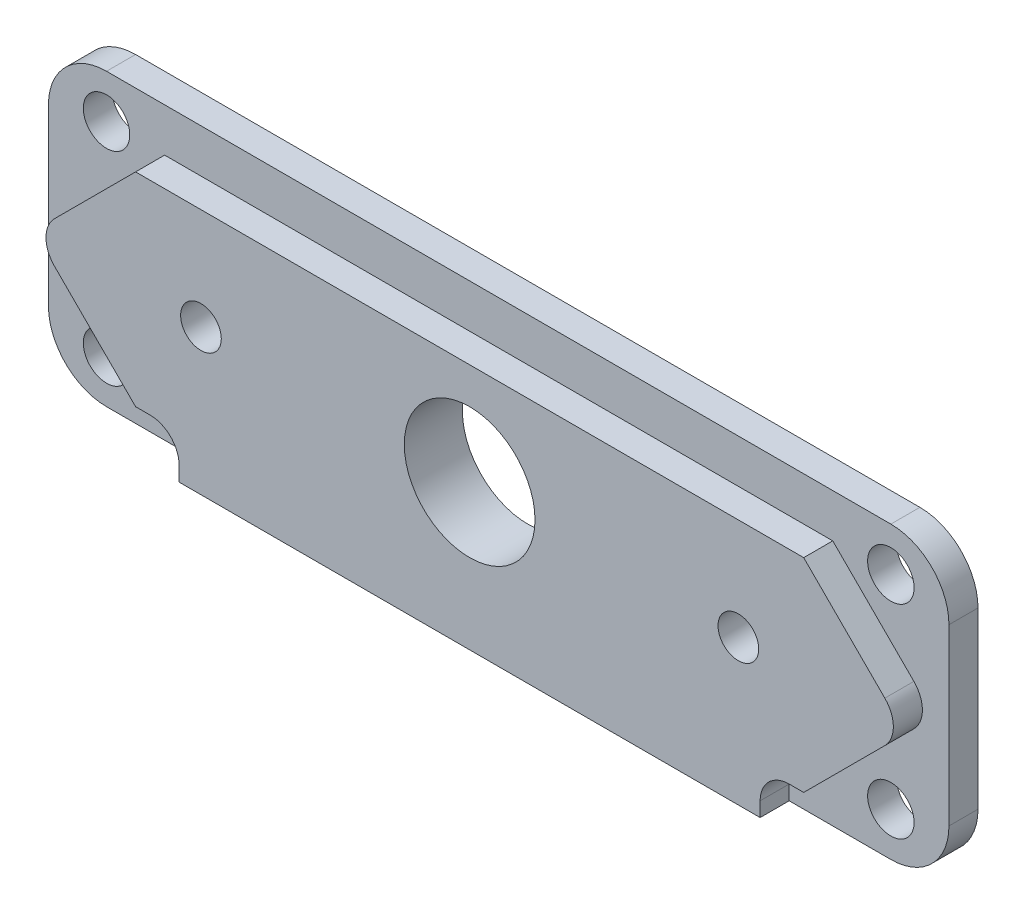
ISO-10303-21;
HEADER;
FILE_DESCRIPTION(('STEP AP214'),'2;1');
FILE_NAME('part.step','',(''),(''),'','','');
FILE_SCHEMA(('AUTOMOTIVE_DESIGN { 1 0 10303 214 1 1 1 1 }'));
ENDSEC;
DATA;
#1=APPLICATION_CONTEXT('core data for automotive mechanical design processes');
#2=APPLICATION_PROTOCOL_DEFINITION('international standard','automotive_design',2000,#1);
#3=PRODUCT_CONTEXT('',#1,'mechanical');
#4=PRODUCT('Part','Part','',(#3));
#5=PRODUCT_RELATED_PRODUCT_CATEGORY('part','',(#4));
#6=PRODUCT_DEFINITION_FORMATION('','',#4);
#7=PRODUCT_DEFINITION_CONTEXT('part definition',#1,'design');
#8=PRODUCT_DEFINITION('design','',#6,#7);
#9=PRODUCT_DEFINITION_SHAPE('','',#8);
#10=(LENGTH_UNIT() NAMED_UNIT(*) SI_UNIT(.MILLI.,.METRE.));
#11=(NAMED_UNIT(*) PLANE_ANGLE_UNIT() SI_UNIT($,.RADIAN.));
#12=(NAMED_UNIT(*) SI_UNIT($,.STERADIAN.) SOLID_ANGLE_UNIT());
#13=UNCERTAINTY_MEASURE_WITH_UNIT(LENGTH_MEASURE(1.E-05),#10,'distance_accuracy_value','');
#14=(GEOMETRIC_REPRESENTATION_CONTEXT(3) GLOBAL_UNCERTAINTY_ASSIGNED_CONTEXT((#13)) GLOBAL_UNIT_ASSIGNED_CONTEXT((#10,
#11,#12)) REPRESENTATION_CONTEXT('',''));
#15=CARTESIAN_POINT('',(0.,0.,0.));
#16=DIRECTION('',(0.,0.,1.));
#17=DIRECTION('',(1.,0.,0.));
#18=AXIS2_PLACEMENT_3D('',#15,#16,#17);
#19=CARTESIAN_POINT('',(27.,6.,2.));
#20=DIRECTION('',(0.,0.,-1.));
#21=DIRECTION('',(-1.,0.,0.));
#22=AXIS2_PLACEMENT_3D('',#19,#20,#21);
#23=PLANE('',#22);
#24=CARTESIAN_POINT('',(27.,-7.,2.));
#25=DIRECTION('',(0.,0.,-1.));
#26=DIRECTION('',(-1.,0.,0.));
#27=AXIS2_PLACEMENT_3D('',#24,#25,#26);
#28=CIRCLE('',#27,1.6);
#29=CARTESIAN_POINT('',(25.4,-7.,2.));
#30=VERTEX_POINT('',#29);
#31=EDGE_CURVE('E715',#30,#30,#28,.F.);
#32=ORIENTED_EDGE('',*,*,#31,.F.);
#33=EDGE_LOOP('',(#32));
#34=FACE_BOUND('',#33,.T.);
#35=CARTESIAN_POINT('',(-27.,-7.,2.));
#36=DIRECTION('',(0.,0.,-1.));
#37=DIRECTION('',(-1.,0.,0.));
#38=AXIS2_PLACEMENT_3D('',#35,#36,#37);
#39=CIRCLE('',#38,1.6);
#40=CARTESIAN_POINT('',(-28.6,-7.,2.));
#41=VERTEX_POINT('',#40);
#42=EDGE_CURVE('E719',#41,#41,#39,.F.);
#43=ORIENTED_EDGE('',*,*,#42,.F.);
#44=EDGE_LOOP('',(#43));
#45=FACE_BOUND('',#44,.T.);
#46=CARTESIAN_POINT('',(-27.,7.,2.));
#47=DIRECTION('',(0.,0.,-1.));
#48=DIRECTION('',(-1.,0.,0.));
#49=AXIS2_PLACEMENT_3D('',#46,#47,#48);
#50=CIRCLE('',#49,1.6);
#51=CARTESIAN_POINT('',(-28.6,7.,2.));
#52=VERTEX_POINT('',#51);
#53=EDGE_CURVE('E728',#52,#52,#50,.F.);
#54=ORIENTED_EDGE('',*,*,#53,.F.);
#55=EDGE_LOOP('',(#54));
#56=FACE_BOUND('',#55,.T.);
#57=CARTESIAN_POINT('',(27.,7.,2.));
#58=DIRECTION('',(0.,0.,-1.));
#59=DIRECTION('',(-1.,0.,0.));
#60=AXIS2_PLACEMENT_3D('',#57,#58,#59);
#61=CIRCLE('',#60,1.6);
#62=CARTESIAN_POINT('',(25.4,7.,2.));
#63=VERTEX_POINT('',#62);
#64=EDGE_CURVE('E734',#63,#63,#61,.F.);
#65=ORIENTED_EDGE('',*,*,#64,.F.);
#66=EDGE_LOOP('',(#65));
#67=FACE_BOUND('',#66,.T.);
#68=DIRECTION('',(0.,1.,0.));
#69=VECTOR('',#68,1.);
#70=CARTESIAN_POINT('',(20.,-10.,2.));
#71=LINE('',#70,#69);
#72=CARTESIAN_POINT('',(20.,-10.,2.));
#73=VERTEX_POINT('',#72);
#74=CARTESIAN_POINT('',(20.,-9.00000000000002,2.));
#75=VERTEX_POINT('',#74);
#76=EDGE_CURVE('E330',#73,#75,#71,.T.);
#77=ORIENTED_EDGE('',*,*,#76,.F.);
#78=DIRECTION('',(1.,0.,0.));
#79=VECTOR('',#78,1.);
#80=CARTESIAN_POINT('',(-27.,-10.,2.));
#81=LINE('',#80,#79);
#82=CARTESIAN_POINT('',(27.,-10.,2.));
#83=VERTEX_POINT('',#82);
#84=EDGE_CURVE('E228',#73,#83,#81,.T.);
#85=ORIENTED_EDGE('',*,*,#84,.T.);
#86=CARTESIAN_POINT('',(27.,-6.,2.));
#87=DIRECTION('',(0.,0.,1.));
#88=DIRECTION('',(1.,0.,0.));
#89=AXIS2_PLACEMENT_3D('',#86,#87,#88);
#90=CIRCLE('',#89,4.);
#91=CARTESIAN_POINT('',(31.,-6.,2.));
#92=VERTEX_POINT('',#91);
#93=EDGE_CURVE('E231',#83,#92,#90,.T.);
#94=ORIENTED_EDGE('',*,*,#93,.T.);
#95=DIRECTION('',(0.,1.,0.));
#96=VECTOR('',#95,1.);
#97=CARTESIAN_POINT('',(31.,-6.,2.));
#98=LINE('',#97,#96);
#99=CARTESIAN_POINT('',(31.,6.,2.));
#100=VERTEX_POINT('',#99);
#101=EDGE_CURVE('E259',#92,#100,#98,.T.);
#102=ORIENTED_EDGE('',*,*,#101,.T.);
#103=CARTESIAN_POINT('',(27.,6.,2.));
#104=DIRECTION('',(0.,0.,1.));
#105=DIRECTION('',(-1.,0.,0.));
#106=AXIS2_PLACEMENT_3D('',#103,#104,#105);
#107=CIRCLE('',#106,4.);
#108=CARTESIAN_POINT('',(27.,10.,2.));
#109=VERTEX_POINT('',#108);
#110=EDGE_CURVE('E216',#100,#109,#107,.T.);
#111=ORIENTED_EDGE('',*,*,#110,.T.);
#112=DIRECTION('',(-1.,0.,0.));
#113=VECTOR('',#112,1.);
#114=CARTESIAN_POINT('',(-27.,10.,2.));
#115=LINE('',#114,#113);
#116=CARTESIAN_POINT('',(-27.,10.,2.));
#117=VERTEX_POINT('',#116);
#118=EDGE_CURVE('E219',#109,#117,#115,.T.);
#119=ORIENTED_EDGE('',*,*,#118,.T.);
#120=CARTESIAN_POINT('',(-27.,6.,2.));
#121=DIRECTION('',(0.,0.,1.));
#122=DIRECTION('',(-1.,0.,0.));
#123=AXIS2_PLACEMENT_3D('',#120,#121,#122);
#124=CIRCLE('',#123,4.);
#125=CARTESIAN_POINT('',(-31.,6.,2.));
#126=VERTEX_POINT('',#125);
#127=EDGE_CURVE('E222',#117,#126,#124,.T.);
#128=ORIENTED_EDGE('',*,*,#127,.T.);
#129=DIRECTION('',(0.,-1.,0.));
#130=VECTOR('',#129,1.);
#131=CARTESIAN_POINT('',(-31.,-6.,2.));
#132=LINE('',#131,#130);
#133=CARTESIAN_POINT('',(-31.,-6.,2.));
#134=VERTEX_POINT('',#133);
#135=EDGE_CURVE('E224',#126,#134,#132,.T.);
#136=ORIENTED_EDGE('',*,*,#135,.T.);
#137=CARTESIAN_POINT('',(-27.,-6.,2.));
#138=DIRECTION('',(0.,0.,1.));
#139=DIRECTION('',(1.,0.,0.));
#140=AXIS2_PLACEMENT_3D('',#137,#138,#139);
#141=CIRCLE('',#140,4.);
#142=CARTESIAN_POINT('',(-27.,-10.,2.));
#143=VERTEX_POINT('',#142);
#144=EDGE_CURVE('E226',#134,#143,#141,.T.);
#145=ORIENTED_EDGE('',*,*,#144,.T.);
#146=CARTESIAN_POINT('',(-20.,-10.,2.));
#147=VERTEX_POINT('',#146);
#148=EDGE_CURVE('E237',#143,#147,#81,.T.);
#149=ORIENTED_EDGE('',*,*,#148,.T.);
#150=DIRECTION('',(0.,-1.,0.));
#151=VECTOR('',#150,1.);
#152=CARTESIAN_POINT('',(-20.,-10.,2.));
#153=LINE('',#152,#151);
#154=CARTESIAN_POINT('',(-20.,-9.00000000000003,2.));
#155=VERTEX_POINT('',#154);
#156=EDGE_CURVE('E327',#155,#147,#153,.T.);
#157=ORIENTED_EDGE('',*,*,#156,.F.);
#158=CARTESIAN_POINT('',(-22.,-9.00000000000003,2.));
#159=DIRECTION('',(0.,0.,-1.));
#160=DIRECTION('',(1.,0.,0.));
#161=AXIS2_PLACEMENT_3D('',#158,#159,#160);
#162=CIRCLE('',#161,2.);
#163=CARTESIAN_POINT('',(-22.,-7.00000000000003,2.));
#164=VERTEX_POINT('',#163);
#165=EDGE_CURVE('E331',#164,#155,#162,.T.);
#166=ORIENTED_EDGE('',*,*,#165,.F.);
#167=DIRECTION('',(1.,0.,0.));
#168=VECTOR('',#167,1.);
#169=CARTESIAN_POINT('',(-23.,-7.00000000000003,2.));
#170=LINE('',#169,#168);
#171=CARTESIAN_POINT('',(-23.,-7.00000000000003,2.));
#172=VERTEX_POINT('',#171);
#173=EDGE_CURVE('E382',#172,#164,#170,.T.);
#174=ORIENTED_EDGE('',*,*,#173,.F.);
#175=DIRECTION('',(0.707106781186546,-0.707106781186549,0.));
#176=VECTOR('',#175,1.);
#177=CARTESIAN_POINT('',(-28.5857864376269,-1.41421356237311,2.));
#178=LINE('',#177,#176);
#179=CARTESIAN_POINT('',(-28.5857864376269,-1.41421356237311,2.));
#180=VERTEX_POINT('',#179);
#181=EDGE_CURVE('E374',#180,#172,#178,.T.);
#182=ORIENTED_EDGE('',*,*,#181,.F.);
#183=CARTESIAN_POINT('',(-27.1715728752538,0.,2.));
#184=DIRECTION('',(0.,0.,1.));
#185=DIRECTION('',(-1.,0.,0.));
#186=AXIS2_PLACEMENT_3D('',#183,#184,#185);
#187=CIRCLE('',#186,1.99999999999999);
#188=CARTESIAN_POINT('',(-28.5857864376269,1.4142135623731,2.));
#189=VERTEX_POINT('',#188);
#190=EDGE_CURVE('E379',#189,#180,#187,.T.);
#191=ORIENTED_EDGE('',*,*,#190,.F.);
#192=DIRECTION('',(-0.707106781186546,-0.707106781186549,0.));
#193=VECTOR('',#192,1.);
#194=CARTESIAN_POINT('',(-28.5857864376269,1.4142135623731,2.));
#195=LINE('',#194,#193);
#196=CARTESIAN_POINT('',(-23.,7.,2.));
#197=VERTEX_POINT('',#196);
#198=EDGE_CURVE('E380',#197,#189,#195,.T.);
#199=ORIENTED_EDGE('',*,*,#198,.F.);
#200=DIRECTION('',(-1.,0.,0.));
#201=VECTOR('',#200,1.);
#202=CARTESIAN_POINT('',(-23.,7.,2.));
#203=LINE('',#202,#201);
#204=CARTESIAN_POINT('',(23.,7.00000000000001,2.));
#205=VERTEX_POINT('',#204);
#206=EDGE_CURVE('E206',#205,#197,#203,.T.);
#207=ORIENTED_EDGE('',*,*,#206,.F.);
#208=DIRECTION('',(-0.707106781186545,0.70710678118655,0.));
#209=VECTOR('',#208,1.);
#210=CARTESIAN_POINT('',(28.5857864376269,1.4142135623731,2.));
#211=LINE('',#210,#209);
#212=CARTESIAN_POINT('',(28.5857864376269,1.4142135623731,2.));
#213=VERTEX_POINT('',#212);
#214=EDGE_CURVE('E203',#213,#205,#211,.T.);
#215=ORIENTED_EDGE('',*,*,#214,.F.);
#216=CARTESIAN_POINT('',(27.1715728752538,0.,2.));
#217=DIRECTION('',(0.,0.,1.));
#218=DIRECTION('',(1.,0.,0.));
#219=AXIS2_PLACEMENT_3D('',#216,#217,#218);
#220=CIRCLE('',#219,2.);
#221=CARTESIAN_POINT('',(28.5857864376269,-1.41421356237311,2.));
#222=VERTEX_POINT('',#221);
#223=EDGE_CURVE('E342',#222,#213,#220,.T.);
#224=ORIENTED_EDGE('',*,*,#223,.F.);
#225=DIRECTION('',(0.707106781186545,0.70710678118655,0.));
#226=VECTOR('',#225,1.);
#227=CARTESIAN_POINT('',(28.5857864376269,-1.41421356237311,2.));
#228=LINE('',#227,#226);
#229=CARTESIAN_POINT('',(23.,-7.00000000000002,2.));
#230=VERTEX_POINT('',#229);
#231=EDGE_CURVE('E339',#230,#222,#228,.T.);
#232=ORIENTED_EDGE('',*,*,#231,.F.);
#233=DIRECTION('',(1.,0.,0.));
#234=VECTOR('',#233,1.);
#235=CARTESIAN_POINT('',(22.,-7.00000000000002,2.));
#236=LINE('',#235,#234);
#237=CARTESIAN_POINT('',(22.,-7.00000000000002,2.));
#238=VERTEX_POINT('',#237);
#239=EDGE_CURVE('E55',#238,#230,#236,.T.);
#240=ORIENTED_EDGE('',*,*,#239,.F.);
#241=CARTESIAN_POINT('',(22.,-9.00000000000002,2.));
#242=DIRECTION('',(0.,0.,-1.));
#243=DIRECTION('',(-1.,0.,0.));
#244=AXIS2_PLACEMENT_3D('',#241,#242,#243);
#245=CIRCLE('',#244,2.);
#246=EDGE_CURVE('E50',#75,#238,#245,.T.);
#247=ORIENTED_EDGE('',*,*,#246,.F.);
#248=EDGE_LOOP('',(#77,#85,#94,#102,#111,#119,#128,#136,#145,#149,#157,#166,#174,#182,#191,#199,
#207,#215,#224,#232,#240,#247));
#249=FACE_BOUND('',#248,.T.);
#250=ADVANCED_FACE('F33',(#34,#45,#56,#67,#249),#23,.F.);
#251=CARTESIAN_POINT('',(27.,6.,2.));
#252=DIRECTION('',(0.,0.,-1.));
#253=DIRECTION('',(-1.,0.,0.));
#254=AXIS2_PLACEMENT_3D('',#251,#252,#253);
#255=CYLINDRICAL_SURFACE('',#254,4.);
#256=CARTESIAN_POINT('',(27.,6.,0.));
#257=DIRECTION('',(0.,0.,1.));
#258=DIRECTION('',(-1.,0.,0.));
#259=AXIS2_PLACEMENT_3D('',#256,#257,#258);
#260=CIRCLE('',#259,4.);
#261=CARTESIAN_POINT('',(31.,6.,0.));
#262=VERTEX_POINT('',#261);
#263=CARTESIAN_POINT('',(27.,10.,0.));
#264=VERTEX_POINT('',#263);
#265=EDGE_CURVE('E207',#262,#264,#260,.T.);
#266=ORIENTED_EDGE('',*,*,#265,.T.);
#267=DIRECTION('',(0.,0.,-1.));
#268=VECTOR('',#267,1.);
#269=CARTESIAN_POINT('',(27.,10.,2.));
#270=LINE('',#269,#268);
#271=EDGE_CURVE('E11',#109,#264,#270,.T.);
#272=ORIENTED_EDGE('',*,*,#271,.F.);
#273=ORIENTED_EDGE('',*,*,#110,.F.);
#274=DIRECTION('',(0.,0.,-1.));
#275=VECTOR('',#274,1.);
#276=CARTESIAN_POINT('',(31.,6.,2.));
#277=LINE('',#276,#275);
#278=EDGE_CURVE('E256',#100,#262,#277,.T.);
#279=ORIENTED_EDGE('',*,*,#278,.T.);
#280=EDGE_LOOP('',(#266,#272,#273,#279));
#281=FACE_BOUND('',#280,.T.);
#282=ADVANCED_FACE('F35',(#281),#255,.T.);
#283=CARTESIAN_POINT('',(-27.,10.,2.));
#284=DIRECTION('',(0.,-1.,0.));
#285=DIRECTION('',(0.,0.,-1.));
#286=AXIS2_PLACEMENT_3D('',#283,#284,#285);
#287=PLANE('',#286);
#288=DIRECTION('',(-1.,0.,0.));
#289=VECTOR('',#288,1.);
#290=CARTESIAN_POINT('',(-27.,10.,0.));
#291=LINE('',#290,#289);
#292=CARTESIAN_POINT('',(-27.,10.,0.));
#293=VERTEX_POINT('',#292);
#294=EDGE_CURVE('E210',#264,#293,#291,.T.);
#295=ORIENTED_EDGE('',*,*,#294,.T.);
#296=DIRECTION('',(0.,0.,-1.));
#297=VECTOR('',#296,1.);
#298=CARTESIAN_POINT('',(-27.,10.,2.));
#299=LINE('',#298,#297);
#300=EDGE_CURVE('E42',#117,#293,#299,.T.);
#301=ORIENTED_EDGE('',*,*,#300,.F.);
#302=ORIENTED_EDGE('',*,*,#118,.F.);
#303=ORIENTED_EDGE('',*,*,#271,.T.);
#304=EDGE_LOOP('',(#295,#301,#302,#303));
#305=FACE_BOUND('',#304,.T.);
#306=ADVANCED_FACE('F291',(#305),#287,.F.);
#307=CARTESIAN_POINT('',(-27.,6.,2.));
#308=DIRECTION('',(0.,0.,-1.));
#309=DIRECTION('',(-1.,0.,0.));
#310=AXIS2_PLACEMENT_3D('',#307,#308,#309);
#311=CYLINDRICAL_SURFACE('',#310,4.);
#312=CARTESIAN_POINT('',(-27.,6.,0.));
#313=DIRECTION('',(0.,0.,1.));
#314=DIRECTION('',(-1.,0.,0.));
#315=AXIS2_PLACEMENT_3D('',#312,#313,#314);
#316=CIRCLE('',#315,4.);
#317=CARTESIAN_POINT('',(-31.,6.,0.));
#318=VERTEX_POINT('',#317);
#319=EDGE_CURVE('E269',#293,#318,#316,.T.);
#320=ORIENTED_EDGE('',*,*,#319,.T.);
#321=DIRECTION('',(0.,0.,-1.));
#322=VECTOR('',#321,1.);
#323=CARTESIAN_POINT('',(-31.,6.,2.));
#324=LINE('',#323,#322);
#325=EDGE_CURVE('E241',#126,#318,#324,.T.);
#326=ORIENTED_EDGE('',*,*,#325,.F.);
#327=ORIENTED_EDGE('',*,*,#127,.F.);
#328=ORIENTED_EDGE('',*,*,#300,.T.);
#329=EDGE_LOOP('',(#320,#326,#327,#328));
#330=FACE_BOUND('',#329,.T.);
#331=ADVANCED_FACE('F294',(#330),#311,.T.);
#332=CARTESIAN_POINT('',(-31.,-6.,2.));
#333=DIRECTION('',(1.,0.,0.));
#334=DIRECTION('',(0.,0.,-1.));
#335=AXIS2_PLACEMENT_3D('',#332,#333,#334);
#336=PLANE('',#335);
#337=DIRECTION('',(0.,-1.,0.));
#338=VECTOR('',#337,1.);
#339=CARTESIAN_POINT('',(-31.,-6.,0.));
#340=LINE('',#339,#338);
#341=CARTESIAN_POINT('',(-31.,-6.,0.));
#342=VERTEX_POINT('',#341);
#343=EDGE_CURVE('E267',#318,#342,#340,.T.);
#344=ORIENTED_EDGE('',*,*,#343,.T.);
#345=DIRECTION('',(0.,0.,-1.));
#346=VECTOR('',#345,1.);
#347=CARTESIAN_POINT('',(-31.,-6.,2.));
#348=LINE('',#347,#346);
#349=EDGE_CURVE('E244',#134,#342,#348,.T.);
#350=ORIENTED_EDGE('',*,*,#349,.F.);
#351=ORIENTED_EDGE('',*,*,#135,.F.);
#352=ORIENTED_EDGE('',*,*,#325,.T.);
#353=EDGE_LOOP('',(#344,#350,#351,#352));
#354=FACE_BOUND('',#353,.T.);
#355=ADVANCED_FACE('F299',(#354),#336,.F.);
#356=CARTESIAN_POINT('',(-27.,-6.,2.));
#357=DIRECTION('',(0.,0.,-1.));
#358=DIRECTION('',(-1.,0.,0.));
#359=AXIS2_PLACEMENT_3D('',#356,#357,#358);
#360=CYLINDRICAL_SURFACE('',#359,4.);
#361=CARTESIAN_POINT('',(-27.,-6.,0.));
#362=DIRECTION('',(0.,0.,1.));
#363=DIRECTION('',(1.,0.,0.));
#364=AXIS2_PLACEMENT_3D('',#361,#362,#363);
#365=CIRCLE('',#364,4.);
#366=CARTESIAN_POINT('',(-27.,-10.,0.));
#367=VERTEX_POINT('',#366);
#368=EDGE_CURVE('E265',#342,#367,#365,.T.);
#369=ORIENTED_EDGE('',*,*,#368,.T.);
#370=DIRECTION('',(0.,0.,-1.));
#371=VECTOR('',#370,1.);
#372=CARTESIAN_POINT('',(-27.,-10.,2.));
#373=LINE('',#372,#371);
#374=EDGE_CURVE('E247',#143,#367,#373,.T.);
#375=ORIENTED_EDGE('',*,*,#374,.F.);
#376=ORIENTED_EDGE('',*,*,#144,.F.);
#377=ORIENTED_EDGE('',*,*,#349,.T.);
#378=EDGE_LOOP('',(#369,#375,#376,#377));
#379=FACE_BOUND('',#378,.T.);
#380=ADVANCED_FACE('F305',(#379),#360,.T.);
#381=CARTESIAN_POINT('',(-27.,-10.,2.));
#382=DIRECTION('',(0.,1.,0.));
#383=DIRECTION('',(0.,0.,1.));
#384=AXIS2_PLACEMENT_3D('',#381,#382,#383);
#385=PLANE('',#384);
#386=DIRECTION('',(1.,0.,0.));
#387=VECTOR('',#386,1.);
#388=CARTESIAN_POINT('',(-27.,-10.,0.));
#389=LINE('',#388,#387);
#390=CARTESIAN_POINT('',(27.,-10.,0.));
#391=VERTEX_POINT('',#390);
#392=EDGE_CURVE('E263',#367,#391,#389,.T.);
#393=ORIENTED_EDGE('',*,*,#392,.T.);
#394=DIRECTION('',(0.,0.,-1.));
#395=VECTOR('',#394,1.);
#396=CARTESIAN_POINT('',(27.,-10.,2.));
#397=LINE('',#396,#395);
#398=EDGE_CURVE('E250',#83,#391,#397,.T.);
#399=ORIENTED_EDGE('',*,*,#398,.F.);
#400=ORIENTED_EDGE('',*,*,#84,.F.);
#401=DIRECTION('',(0.,0.,-1.));
#402=VECTOR('',#401,1.);
#403=CARTESIAN_POINT('',(20.,-10.,4.));
#404=LINE('',#403,#402);
#405=CARTESIAN_POINT('',(20.,-10.,4.));
#406=VERTEX_POINT('',#405);
#407=EDGE_CURVE('E319',#406,#73,#404,.T.);
#408=ORIENTED_EDGE('',*,*,#407,.F.);
#409=DIRECTION('',(1.,0.,0.));
#410=VECTOR('',#409,1.);
#411=CARTESIAN_POINT('',(-20.,-10.,4.));
#412=LINE('',#411,#410);
#413=CARTESIAN_POINT('',(-20.,-10.,4.));
#414=VERTEX_POINT('',#413);
#415=EDGE_CURVE('E315',#414,#406,#412,.T.);
#416=ORIENTED_EDGE('',*,*,#415,.F.);
#417=DIRECTION('',(0.,0.,-1.));
#418=VECTOR('',#417,1.);
#419=CARTESIAN_POINT('',(-20.,-10.,4.));
#420=LINE('',#419,#418);
#421=EDGE_CURVE('E313',#414,#147,#420,.T.);
#422=ORIENTED_EDGE('',*,*,#421,.T.);
#423=ORIENTED_EDGE('',*,*,#148,.F.);
#424=ORIENTED_EDGE('',*,*,#374,.T.);
#425=EDGE_LOOP('',(#393,#399,#400,#408,#416,#422,#423,#424));
#426=FACE_BOUND('',#425,.T.);
#427=ADVANCED_FACE('F310',(#426),#385,.F.);
#428=CARTESIAN_POINT('',(27.,-6.,2.));
#429=DIRECTION('',(0.,0.,-1.));
#430=DIRECTION('',(-1.,0.,0.));
#431=AXIS2_PLACEMENT_3D('',#428,#429,#430);
#432=CYLINDRICAL_SURFACE('',#431,4.);
#433=CARTESIAN_POINT('',(27.,-6.,0.));
#434=DIRECTION('',(0.,0.,1.));
#435=DIRECTION('',(1.,0.,0.));
#436=AXIS2_PLACEMENT_3D('',#433,#434,#435);
#437=CIRCLE('',#436,4.);
#438=CARTESIAN_POINT('',(31.,-6.,0.));
#439=VERTEX_POINT('',#438);
#440=EDGE_CURVE('E261',#391,#439,#437,.T.);
#441=ORIENTED_EDGE('',*,*,#440,.T.);
#442=DIRECTION('',(0.,0.,-1.));
#443=VECTOR('',#442,1.);
#444=CARTESIAN_POINT('',(31.,-6.,2.));
#445=LINE('',#444,#443);
#446=EDGE_CURVE('E253',#92,#439,#445,.T.);
#447=ORIENTED_EDGE('',*,*,#446,.F.);
#448=ORIENTED_EDGE('',*,*,#93,.F.);
#449=ORIENTED_EDGE('',*,*,#398,.T.);
#450=EDGE_LOOP('',(#441,#447,#448,#449));
#451=FACE_BOUND('',#450,.T.);
#452=ADVANCED_FACE('F278',(#451),#432,.T.);
#453=CARTESIAN_POINT('',(31.,-6.,2.));
#454=DIRECTION('',(-1.,0.,0.));
#455=DIRECTION('',(0.,0.,1.));
#456=AXIS2_PLACEMENT_3D('',#453,#454,#455);
#457=PLANE('',#456);
#458=DIRECTION('',(0.,1.,0.));
#459=VECTOR('',#458,1.);
#460=CARTESIAN_POINT('',(31.,-6.,0.));
#461=LINE('',#460,#459);
#462=EDGE_CURVE('E220',#439,#262,#461,.T.);
#463=ORIENTED_EDGE('',*,*,#462,.T.);
#464=ORIENTED_EDGE('',*,*,#278,.F.);
#465=ORIENTED_EDGE('',*,*,#101,.F.);
#466=ORIENTED_EDGE('',*,*,#446,.T.);
#467=EDGE_LOOP('',(#463,#464,#465,#466));
#468=FACE_BOUND('',#467,.T.);
#469=ADVANCED_FACE('F282',(#468),#457,.F.);
#470=CARTESIAN_POINT('',(27.,6.,0.));
#471=DIRECTION('',(0.,0.,-1.));
#472=DIRECTION('',(-1.,0.,0.));
#473=AXIS2_PLACEMENT_3D('',#470,#471,#472);
#474=PLANE('',#473);
#475=CARTESIAN_POINT('',(27.,-7.,0.));
#476=DIRECTION('',(0.,0.,-1.));
#477=DIRECTION('',(-1.,0.,0.));
#478=AXIS2_PLACEMENT_3D('',#475,#476,#477);
#479=CIRCLE('',#478,1.6);
#480=CARTESIAN_POINT('',(25.4,-7.,0.));
#481=VERTEX_POINT('',#480);
#482=EDGE_CURVE('E713',#481,#481,#479,.T.);
#483=ORIENTED_EDGE('',*,*,#482,.F.);
#484=EDGE_LOOP('',(#483));
#485=FACE_BOUND('',#484,.T.);
#486=CARTESIAN_POINT('',(-27.,-7.,0.));
#487=DIRECTION('',(0.,0.,-1.));
#488=DIRECTION('',(-1.,0.,0.));
#489=AXIS2_PLACEMENT_3D('',#486,#487,#488);
#490=CIRCLE('',#489,1.6);
#491=CARTESIAN_POINT('',(-28.6,-7.,0.));
#492=VERTEX_POINT('',#491);
#493=EDGE_CURVE('E716',#492,#492,#490,.T.);
#494=ORIENTED_EDGE('',*,*,#493,.F.);
#495=EDGE_LOOP('',(#494));
#496=FACE_BOUND('',#495,.T.);
#497=CARTESIAN_POINT('',(-27.,7.,0.));
#498=DIRECTION('',(0.,0.,-1.));
#499=DIRECTION('',(-1.,0.,0.));
#500=AXIS2_PLACEMENT_3D('',#497,#498,#499);
#501=CIRCLE('',#500,1.6);
#502=CARTESIAN_POINT('',(-28.6,7.,0.));
#503=VERTEX_POINT('',#502);
#504=EDGE_CURVE('E725',#503,#503,#501,.T.);
#505=ORIENTED_EDGE('',*,*,#504,.F.);
#506=EDGE_LOOP('',(#505));
#507=FACE_BOUND('',#506,.T.);
#508=CARTESIAN_POINT('',(27.,7.,0.));
#509=DIRECTION('',(0.,0.,-1.));
#510=DIRECTION('',(-1.,0.,0.));
#511=AXIS2_PLACEMENT_3D('',#508,#509,#510);
#512=CIRCLE('',#511,1.6);
#513=CARTESIAN_POINT('',(25.4,7.,0.));
#514=VERTEX_POINT('',#513);
#515=EDGE_CURVE('E731',#514,#514,#512,.T.);
#516=ORIENTED_EDGE('',*,*,#515,.F.);
#517=EDGE_LOOP('',(#516));
#518=FACE_BOUND('',#517,.T.);
#519=CARTESIAN_POINT('',(-18.5,0.,0.));
#520=DIRECTION('',(0.,0.,-1.));
#521=DIRECTION('',(1.,0.,0.));
#522=AXIS2_PLACEMENT_3D('',#519,#520,#521);
#523=CIRCLE('',#522,1.4);
#524=CARTESIAN_POINT('',(-17.1,0.,0.));
#525=VERTEX_POINT('',#524);
#526=EDGE_CURVE('E738',#525,#525,#523,.T.);
#527=ORIENTED_EDGE('',*,*,#526,.F.);
#528=EDGE_LOOP('',(#527));
#529=FACE_BOUND('',#528,.T.);
#530=CARTESIAN_POINT('',(18.5,0.,0.));
#531=DIRECTION('',(0.,0.,-1.));
#532=DIRECTION('',(-1.,0.,0.));
#533=AXIS2_PLACEMENT_3D('',#530,#531,#532);
#534=CIRCLE('',#533,1.4);
#535=CARTESIAN_POINT('',(17.1,0.,0.));
#536=VERTEX_POINT('',#535);
#537=EDGE_CURVE('E420',#536,#536,#534,.T.);
#538=ORIENTED_EDGE('',*,*,#537,.F.);
#539=EDGE_LOOP('',(#538));
#540=FACE_BOUND('',#539,.T.);
#541=CARTESIAN_POINT('',(0.,0.,0.));
#542=DIRECTION('',(0.,0.,-1.));
#543=DIRECTION('',(-1.,0.,0.));
#544=AXIS2_PLACEMENT_3D('',#541,#542,#543);
#545=CIRCLE('',#544,4.5);
#546=CARTESIAN_POINT('',(-4.5,0.,0.));
#547=VERTEX_POINT('',#546);
#548=EDGE_CURVE('E413',#547,#547,#545,.T.);
#549=ORIENTED_EDGE('',*,*,#548,.F.);
#550=EDGE_LOOP('',(#549));
#551=FACE_BOUND('',#550,.T.);
#552=ORIENTED_EDGE('',*,*,#265,.F.);
#553=ORIENTED_EDGE('',*,*,#462,.F.);
#554=ORIENTED_EDGE('',*,*,#440,.F.);
#555=ORIENTED_EDGE('',*,*,#392,.F.);
#556=ORIENTED_EDGE('',*,*,#368,.F.);
#557=ORIENTED_EDGE('',*,*,#343,.F.);
#558=ORIENTED_EDGE('',*,*,#319,.F.);
#559=ORIENTED_EDGE('',*,*,#294,.F.);
#560=EDGE_LOOP('',(#552,#553,#554,#555,#556,#557,#558,#559));
#561=FACE_BOUND('',#560,.T.);
#562=ADVANCED_FACE('F448',(#485,#496,#507,#518,#529,#540,#551,#561),#474,.T.);
#563=CARTESIAN_POINT('',(-23.,7.,4.));
#564=DIRECTION('',(0.,-1.,0.));
#565=DIRECTION('',(1.,0.,0.));
#566=AXIS2_PLACEMENT_3D('',#563,#564,#565);
#567=PLANE('',#566);
#568=ORIENTED_EDGE('',*,*,#206,.T.);
#569=DIRECTION('',(0.,0.,-1.));
#570=VECTOR('',#569,1.);
#571=CARTESIAN_POINT('',(-23.,7.,4.));
#572=LINE('',#571,#570);
#573=CARTESIAN_POINT('',(-23.,7.,4.));
#574=VERTEX_POINT('',#573);
#575=EDGE_CURVE('E187',#574,#197,#572,.T.);
#576=ORIENTED_EDGE('',*,*,#575,.F.);
#577=DIRECTION('',(-1.,0.,0.));
#578=VECTOR('',#577,1.);
#579=CARTESIAN_POINT('',(-23.,7.,4.));
#580=LINE('',#579,#578);
#581=CARTESIAN_POINT('',(23.,7.00000000000001,4.));
#582=VERTEX_POINT('',#581);
#583=EDGE_CURVE('E194',#582,#574,#580,.T.);
#584=ORIENTED_EDGE('',*,*,#583,.F.);
#585=DIRECTION('',(0.,0.,-1.));
#586=VECTOR('',#585,1.);
#587=CARTESIAN_POINT('',(23.,7.00000000000001,4.));
#588=LINE('',#587,#586);
#589=EDGE_CURVE('E347',#582,#205,#588,.T.);
#590=ORIENTED_EDGE('',*,*,#589,.T.);
#591=EDGE_LOOP('',(#568,#576,#584,#590));
#592=FACE_BOUND('',#591,.T.);
#593=ADVANCED_FACE('F205',(#592),#567,.F.);
#594=CARTESIAN_POINT('',(-28.5857864376269,1.4142135623731,4.));
#595=DIRECTION('',(0.707106781186549,-0.707106781186546,0.));
#596=DIRECTION('',(0.707106781186546,0.707106781186549,0.));
#597=AXIS2_PLACEMENT_3D('',#594,#595,#596);
#598=PLANE('',#597);
#599=ORIENTED_EDGE('',*,*,#198,.T.);
#600=DIRECTION('',(0.,0.,-1.));
#601=VECTOR('',#600,1.);
#602=CARTESIAN_POINT('',(-28.5857864376269,1.4142135623731,4.));
#603=LINE('',#602,#601);
#604=CARTESIAN_POINT('',(-28.5857864376269,1.4142135623731,4.));
#605=VERTEX_POINT('',#604);
#606=EDGE_CURVE('E190',#605,#189,#603,.T.);
#607=ORIENTED_EDGE('',*,*,#606,.F.);
#608=DIRECTION('',(-0.707106781186546,-0.707106781186549,0.));
#609=VECTOR('',#608,1.);
#610=CARTESIAN_POINT('',(-28.5857864376269,1.4142135623731,4.));
#611=LINE('',#610,#609);
#612=EDGE_CURVE('E182',#574,#605,#611,.T.);
#613=ORIENTED_EDGE('',*,*,#612,.F.);
#614=ORIENTED_EDGE('',*,*,#575,.T.);
#615=EDGE_LOOP('',(#599,#607,#613,#614));
#616=FACE_BOUND('',#615,.T.);
#617=ADVANCED_FACE('F185',(#616),#598,.F.);
#618=CARTESIAN_POINT('',(-27.1715728752538,0.,4.));
#619=DIRECTION('',(0.,0.,-1.));
#620=DIRECTION('',(-1.,0.,0.));
#621=AXIS2_PLACEMENT_3D('',#618,#619,#620);
#622=CYLINDRICAL_SURFACE('',#621,1.99999999999999);
#623=ORIENTED_EDGE('',*,*,#190,.T.);
#624=DIRECTION('',(0.,0.,-1.));
#625=VECTOR('',#624,1.);
#626=CARTESIAN_POINT('',(-28.5857864376269,-1.41421356237311,4.));
#627=LINE('',#626,#625);
#628=CARTESIAN_POINT('',(-28.5857864376269,-1.41421356237311,4.));
#629=VERTEX_POINT('',#628);
#630=EDGE_CURVE('E212',#629,#180,#627,.T.);
#631=ORIENTED_EDGE('',*,*,#630,.F.);
#632=CARTESIAN_POINT('',(-27.1715728752538,0.,4.));
#633=DIRECTION('',(0.,0.,1.));
#634=DIRECTION('',(-1.,0.,0.));
#635=AXIS2_PLACEMENT_3D('',#632,#633,#634);
#636=CIRCLE('',#635,1.99999999999999);
#637=EDGE_CURVE('E193',#605,#629,#636,.T.);
#638=ORIENTED_EDGE('',*,*,#637,.F.);
#639=ORIENTED_EDGE('',*,*,#606,.T.);
#640=EDGE_LOOP('',(#623,#631,#638,#639));
#641=FACE_BOUND('',#640,.T.);
#642=ADVANCED_FACE('F378',(#641),#622,.T.);
#643=CARTESIAN_POINT('',(-28.5857864376269,-1.41421356237311,4.));
#644=DIRECTION('',(0.707106781186549,0.707106781186546,0.));
#645=DIRECTION('',(-0.707106781186546,0.707106781186549,0.));
#646=AXIS2_PLACEMENT_3D('',#643,#644,#645);
#647=PLANE('',#646);
#648=ORIENTED_EDGE('',*,*,#181,.T.);
#649=DIRECTION('',(0.,0.,-1.));
#650=VECTOR('',#649,1.);
#651=CARTESIAN_POINT('',(-23.,-7.00000000000003,4.));
#652=LINE('',#651,#650);
#653=CARTESIAN_POINT('',(-23.,-7.00000000000003,4.));
#654=VERTEX_POINT('',#653);
#655=EDGE_CURVE('E365',#654,#172,#652,.T.);
#656=ORIENTED_EDGE('',*,*,#655,.F.);
#657=DIRECTION('',(0.707106781186546,-0.707106781186549,0.));
#658=VECTOR('',#657,1.);
#659=CARTESIAN_POINT('',(-28.5857864376269,-1.41421356237311,4.));
#660=LINE('',#659,#658);
#661=EDGE_CURVE('E375',#629,#654,#660,.T.);
#662=ORIENTED_EDGE('',*,*,#661,.F.);
#663=ORIENTED_EDGE('',*,*,#630,.T.);
#664=EDGE_LOOP('',(#648,#656,#662,#663));
#665=FACE_BOUND('',#664,.T.);
#666=ADVANCED_FACE('F372',(#665),#647,.F.);
#667=CARTESIAN_POINT('',(-23.,-7.00000000000003,4.));
#668=DIRECTION('',(0.,1.,0.));
#669=DIRECTION('',(-1.,0.,0.));
#670=AXIS2_PLACEMENT_3D('',#667,#668,#669);
#671=PLANE('',#670);
#672=ORIENTED_EDGE('',*,*,#173,.T.);
#673=DIRECTION('',(0.,0.,-1.));
#674=VECTOR('',#673,1.);
#675=CARTESIAN_POINT('',(-22.,-7.00000000000003,4.));
#676=LINE('',#675,#674);
#677=CARTESIAN_POINT('',(-22.,-7.00000000000003,4.));
#678=VERTEX_POINT('',#677);
#679=EDGE_CURVE('E321',#678,#164,#676,.T.);
#680=ORIENTED_EDGE('',*,*,#679,.F.);
#681=DIRECTION('',(1.,0.,0.));
#682=VECTOR('',#681,1.);
#683=CARTESIAN_POINT('',(-23.,-7.00000000000003,4.));
#684=LINE('',#683,#682);
#685=EDGE_CURVE('E400',#654,#678,#684,.T.);
#686=ORIENTED_EDGE('',*,*,#685,.F.);
#687=ORIENTED_EDGE('',*,*,#655,.T.);
#688=EDGE_LOOP('',(#672,#680,#686,#687));
#689=FACE_BOUND('',#688,.T.);
#690=ADVANCED_FACE('F428',(#689),#671,.F.);
#691=CARTESIAN_POINT('',(-22.,-9.00000000000003,4.));
#692=DIRECTION('',(0.,0.,-1.));
#693=DIRECTION('',(-1.,0.,0.));
#694=AXIS2_PLACEMENT_3D('',#691,#692,#693);
#695=CYLINDRICAL_SURFACE('',#694,2.);
#696=ORIENTED_EDGE('',*,*,#165,.T.);
#697=DIRECTION('',(0.,0.,-1.));
#698=VECTOR('',#697,1.);
#699=CARTESIAN_POINT('',(-20.,-9.00000000000003,4.));
#700=LINE('',#699,#698);
#701=CARTESIAN_POINT('',(-20.,-9.00000000000003,4.));
#702=VERTEX_POINT('',#701);
#703=EDGE_CURVE('E318',#702,#155,#700,.T.);
#704=ORIENTED_EDGE('',*,*,#703,.F.);
#705=CARTESIAN_POINT('',(-22.,-9.00000000000003,4.));
#706=DIRECTION('',(0.,0.,-1.));
#707=DIRECTION('',(1.,0.,0.));
#708=AXIS2_PLACEMENT_3D('',#705,#706,#707);
#709=CIRCLE('',#708,2.);
#710=EDGE_CURVE('E396',#678,#702,#709,.T.);
#711=ORIENTED_EDGE('',*,*,#710,.F.);
#712=ORIENTED_EDGE('',*,*,#679,.T.);
#713=EDGE_LOOP('',(#696,#704,#711,#712));
#714=FACE_BOUND('',#713,.T.);
#715=ADVANCED_FACE('F392',(#714),#695,.F.);
#716=CARTESIAN_POINT('',(-20.,-10.,4.));
#717=DIRECTION('',(1.,0.,0.));
#718=DIRECTION('',(0.,0.,-1.));
#719=AXIS2_PLACEMENT_3D('',#716,#717,#718);
#720=PLANE('',#719);
#721=ORIENTED_EDGE('',*,*,#156,.T.);
#722=ORIENTED_EDGE('',*,*,#421,.F.);
#723=DIRECTION('',(0.,-1.,0.));
#724=VECTOR('',#723,1.);
#725=CARTESIAN_POINT('',(-20.,-10.,4.));
#726=LINE('',#725,#724);
#727=EDGE_CURVE('E395',#702,#414,#726,.T.);
#728=ORIENTED_EDGE('',*,*,#727,.F.);
#729=ORIENTED_EDGE('',*,*,#703,.T.);
#730=EDGE_LOOP('',(#721,#722,#728,#729));
#731=FACE_BOUND('',#730,.T.);
#732=ADVANCED_FACE('F394',(#731),#720,.F.);
#733=CARTESIAN_POINT('',(20.,-10.,4.));
#734=DIRECTION('',(-1.,0.,0.));
#735=DIRECTION('',(0.,-1.,0.));
#736=AXIS2_PLACEMENT_3D('',#733,#734,#735);
#737=PLANE('',#736);
#738=ORIENTED_EDGE('',*,*,#76,.T.);
#739=DIRECTION('',(0.,0.,-1.));
#740=VECTOR('',#739,1.);
#741=CARTESIAN_POINT('',(20.,-9.00000000000002,4.));
#742=LINE('',#741,#740);
#743=CARTESIAN_POINT('',(20.,-9.00000000000002,4.));
#744=VERTEX_POINT('',#743);
#745=EDGE_CURVE('E324',#744,#75,#742,.T.);
#746=ORIENTED_EDGE('',*,*,#745,.F.);
#747=DIRECTION('',(0.,1.,0.));
#748=VECTOR('',#747,1.);
#749=CARTESIAN_POINT('',(20.,-10.,4.));
#750=LINE('',#749,#748);
#751=EDGE_CURVE('E398',#406,#744,#750,.T.);
#752=ORIENTED_EDGE('',*,*,#751,.F.);
#753=ORIENTED_EDGE('',*,*,#407,.T.);
#754=EDGE_LOOP('',(#738,#746,#752,#753));
#755=FACE_BOUND('',#754,.T.);
#756=ADVANCED_FACE('F536',(#755),#737,.F.);
#757=CARTESIAN_POINT('',(22.,-9.00000000000002,4.));
#758=DIRECTION('',(0.,0.,-1.));
#759=DIRECTION('',(-1.,0.,0.));
#760=AXIS2_PLACEMENT_3D('',#757,#758,#759);
#761=CYLINDRICAL_SURFACE('',#760,2.);
#762=ORIENTED_EDGE('',*,*,#246,.T.);
#763=DIRECTION('',(0.,0.,-1.));
#764=VECTOR('',#763,1.);
#765=CARTESIAN_POINT('',(22.,-7.00000000000002,4.));
#766=LINE('',#765,#764);
#767=CARTESIAN_POINT('',(22.,-7.00000000000002,4.));
#768=VERTEX_POINT('',#767);
#769=EDGE_CURVE('E358',#768,#238,#766,.T.);
#770=ORIENTED_EDGE('',*,*,#769,.F.);
#771=CARTESIAN_POINT('',(22.,-9.00000000000002,4.));
#772=DIRECTION('',(0.,0.,-1.));
#773=DIRECTION('',(-1.,0.,0.));
#774=AXIS2_PLACEMENT_3D('',#771,#772,#773);
#775=CIRCLE('',#774,2.);
#776=EDGE_CURVE('E405',#744,#768,#775,.T.);
#777=ORIENTED_EDGE('',*,*,#776,.F.);
#778=ORIENTED_EDGE('',*,*,#745,.T.);
#779=EDGE_LOOP('',(#762,#770,#777,#778));
#780=FACE_BOUND('',#779,.T.);
#781=ADVANCED_FACE('F545',(#780),#761,.F.);
#782=CARTESIAN_POINT('',(22.,-7.00000000000002,4.));
#783=DIRECTION('',(0.,1.,0.));
#784=DIRECTION('',(-1.,0.,0.));
#785=AXIS2_PLACEMENT_3D('',#782,#783,#784);
#786=PLANE('',#785);
#787=ORIENTED_EDGE('',*,*,#239,.T.);
#788=DIRECTION('',(0.,0.,-1.));
#789=VECTOR('',#788,1.);
#790=CARTESIAN_POINT('',(23.,-7.00000000000002,4.));
#791=LINE('',#790,#789);
#792=CARTESIAN_POINT('',(23.,-7.00000000000002,4.));
#793=VERTEX_POINT('',#792);
#794=EDGE_CURVE('E355',#793,#230,#791,.T.);
#795=ORIENTED_EDGE('',*,*,#794,.F.);
#796=DIRECTION('',(1.,0.,0.));
#797=VECTOR('',#796,1.);
#798=CARTESIAN_POINT('',(22.,-7.00000000000002,4.));
#799=LINE('',#798,#797);
#800=EDGE_CURVE('E407',#768,#793,#799,.T.);
#801=ORIENTED_EDGE('',*,*,#800,.F.);
#802=ORIENTED_EDGE('',*,*,#769,.T.);
#803=EDGE_LOOP('',(#787,#795,#801,#802));
#804=FACE_BOUND('',#803,.T.);
#805=ADVANCED_FACE('F555',(#804),#786,.F.);
#806=CARTESIAN_POINT('',(28.5857864376269,-1.41421356237311,4.));
#807=DIRECTION('',(-0.70710678118655,0.707106781186545,0.));
#808=DIRECTION('',(-0.707106781186545,-0.70710678118655,0.));
#809=AXIS2_PLACEMENT_3D('',#806,#807,#808);
#810=PLANE('',#809);
#811=ORIENTED_EDGE('',*,*,#231,.T.);
#812=DIRECTION('',(0.,0.,-1.));
#813=VECTOR('',#812,1.);
#814=CARTESIAN_POINT('',(28.5857864376269,-1.41421356237311,4.));
#815=LINE('',#814,#813);
#816=CARTESIAN_POINT('',(28.5857864376269,-1.41421356237311,4.));
#817=VERTEX_POINT('',#816);
#818=EDGE_CURVE('E352',#817,#222,#815,.T.);
#819=ORIENTED_EDGE('',*,*,#818,.F.);
#820=DIRECTION('',(0.707106781186545,0.70710678118655,0.));
#821=VECTOR('',#820,1.);
#822=CARTESIAN_POINT('',(28.5857864376269,-1.41421356237311,4.));
#823=LINE('',#822,#821);
#824=EDGE_CURVE('E409',#793,#817,#823,.T.);
#825=ORIENTED_EDGE('',*,*,#824,.F.);
#826=ORIENTED_EDGE('',*,*,#794,.T.);
#827=EDGE_LOOP('',(#811,#819,#825,#826));
#828=FACE_BOUND('',#827,.T.);
#829=ADVANCED_FACE('F565',(#828),#810,.F.);
#830=CARTESIAN_POINT('',(27.1715728752538,0.,4.));
#831=DIRECTION('',(0.,0.,-1.));
#832=DIRECTION('',(-1.,0.,0.));
#833=AXIS2_PLACEMENT_3D('',#830,#831,#832);
#834=CYLINDRICAL_SURFACE('',#833,2.);
#835=ORIENTED_EDGE('',*,*,#223,.T.);
#836=DIRECTION('',(0.,0.,-1.));
#837=VECTOR('',#836,1.);
#838=CARTESIAN_POINT('',(28.5857864376269,1.4142135623731,4.));
#839=LINE('',#838,#837);
#840=CARTESIAN_POINT('',(28.5857864376269,1.4142135623731,4.));
#841=VERTEX_POINT('',#840);
#842=EDGE_CURVE('E349',#841,#213,#839,.T.);
#843=ORIENTED_EDGE('',*,*,#842,.F.);
#844=CARTESIAN_POINT('',(27.1715728752538,0.,4.));
#845=DIRECTION('',(0.,0.,1.));
#846=DIRECTION('',(1.,0.,0.));
#847=AXIS2_PLACEMENT_3D('',#844,#845,#846);
#848=CIRCLE('',#847,2.);
#849=EDGE_CURVE('E411',#817,#841,#848,.T.);
#850=ORIENTED_EDGE('',*,*,#849,.F.);
#851=ORIENTED_EDGE('',*,*,#818,.T.);
#852=EDGE_LOOP('',(#835,#843,#850,#851));
#853=FACE_BOUND('',#852,.T.);
#854=ADVANCED_FACE('F575',(#853),#834,.T.);
#855=CARTESIAN_POINT('',(28.5857864376269,1.4142135623731,4.));
#856=DIRECTION('',(-0.70710678118655,-0.707106781186545,0.));
#857=DIRECTION('',(0.707106781186545,-0.70710678118655,0.));
#858=AXIS2_PLACEMENT_3D('',#855,#856,#857);
#859=PLANE('',#858);
#860=ORIENTED_EDGE('',*,*,#214,.T.);
#861=ORIENTED_EDGE('',*,*,#589,.F.);
#862=DIRECTION('',(-0.707106781186545,0.70710678118655,0.));
#863=VECTOR('',#862,1.);
#864=CARTESIAN_POINT('',(28.5857864376269,1.4142135623731,4.));
#865=LINE('',#864,#863);
#866=EDGE_CURVE('E199',#841,#582,#865,.T.);
#867=ORIENTED_EDGE('',*,*,#866,.F.);
#868=ORIENTED_EDGE('',*,*,#842,.T.);
#869=EDGE_LOOP('',(#860,#861,#867,#868));
#870=FACE_BOUND('',#869,.T.);
#871=ADVANCED_FACE('F585',(#870),#859,.F.);
#872=CARTESIAN_POINT('',(27.1715728752538,0.,4.));
#873=DIRECTION('',(0.,0.,1.));
#874=DIRECTION('',(1.,0.,0.));
#875=AXIS2_PLACEMENT_3D('',#872,#873,#874);
#876=PLANE('',#875);
#877=CARTESIAN_POINT('',(-18.5,0.,4.));
#878=DIRECTION('',(0.,0.,1.));
#879=DIRECTION('',(1.,0.,0.));
#880=AXIS2_PLACEMENT_3D('',#877,#878,#879);
#881=CIRCLE('',#880,1.4);
#882=CARTESIAN_POINT('',(-17.1,0.,4.));
#883=VERTEX_POINT('',#882);
#884=EDGE_CURVE('E737',#883,#883,#881,.F.);
#885=ORIENTED_EDGE('',*,*,#884,.T.);
#886=EDGE_LOOP('',(#885));
#887=FACE_BOUND('',#886,.T.);
#888=CARTESIAN_POINT('',(18.5,0.,4.));
#889=DIRECTION('',(0.,0.,1.));
#890=DIRECTION('',(1.,0.,0.));
#891=AXIS2_PLACEMENT_3D('',#888,#889,#890);
#892=CIRCLE('',#891,1.4);
#893=CARTESIAN_POINT('',(19.9,0.,4.));
#894=VERTEX_POINT('',#893);
#895=EDGE_CURVE('E423',#894,#894,#892,.F.);
#896=ORIENTED_EDGE('',*,*,#895,.T.);
#897=EDGE_LOOP('',(#896));
#898=FACE_BOUND('',#897,.T.);
#899=CARTESIAN_POINT('',(0.,0.,4.));
#900=DIRECTION('',(0.,0.,1.));
#901=DIRECTION('',(1.,0.,0.));
#902=AXIS2_PLACEMENT_3D('',#899,#900,#901);
#903=CIRCLE('',#902,4.5);
#904=CARTESIAN_POINT('',(4.5,0.,4.));
#905=VERTEX_POINT('',#904);
#906=EDGE_CURVE('E415',#905,#905,#903,.F.);
#907=ORIENTED_EDGE('',*,*,#906,.T.);
#908=EDGE_LOOP('',(#907));
#909=FACE_BOUND('',#908,.T.);
#910=ORIENTED_EDGE('',*,*,#583,.T.);
#911=ORIENTED_EDGE('',*,*,#612,.T.);
#912=ORIENTED_EDGE('',*,*,#637,.T.);
#913=ORIENTED_EDGE('',*,*,#661,.T.);
#914=ORIENTED_EDGE('',*,*,#685,.T.);
#915=ORIENTED_EDGE('',*,*,#710,.T.);
#916=ORIENTED_EDGE('',*,*,#727,.T.);
#917=ORIENTED_EDGE('',*,*,#415,.T.);
#918=ORIENTED_EDGE('',*,*,#751,.T.);
#919=ORIENTED_EDGE('',*,*,#776,.T.);
#920=ORIENTED_EDGE('',*,*,#800,.T.);
#921=ORIENTED_EDGE('',*,*,#824,.T.);
#922=ORIENTED_EDGE('',*,*,#849,.T.);
#923=ORIENTED_EDGE('',*,*,#866,.T.);
#924=EDGE_LOOP('',(#910,#911,#912,#913,#914,#915,#916,#917,#918,#919,#920,#921,#922,#923));
#925=FACE_BOUND('',#924,.T.);
#926=ADVANCED_FACE('F197',(#887,#898,#909,#925),#876,.T.);
#927=CARTESIAN_POINT('',(0.,0.,4.001025));
#928=DIRECTION('',(0.,0.,-1.));
#929=DIRECTION('',(-1.,0.,0.));
#930=AXIS2_PLACEMENT_3D('',#927,#928,#929);
#931=CYLINDRICAL_SURFACE('',#930,4.5);
#932=ORIENTED_EDGE('',*,*,#906,.F.);
#933=EDGE_LOOP('',(#932));
#934=FACE_BOUND('',#933,.T.);
#935=ORIENTED_EDGE('',*,*,#548,.T.);
#936=EDGE_LOOP('',(#935));
#937=FACE_BOUND('',#936,.T.);
#938=ADVANCED_FACE('F604',(#934,#937),#931,.F.);
#939=CARTESIAN_POINT('',(18.5,0.,4.001025));
#940=DIRECTION('',(0.,0.,-1.));
#941=DIRECTION('',(-1.,0.,0.));
#942=AXIS2_PLACEMENT_3D('',#939,#940,#941);
#943=CYLINDRICAL_SURFACE('',#942,1.4);
#944=ORIENTED_EDGE('',*,*,#895,.F.);
#945=EDGE_LOOP('',(#944));
#946=FACE_BOUND('',#945,.T.);
#947=ORIENTED_EDGE('',*,*,#537,.T.);
#948=EDGE_LOOP('',(#947));
#949=FACE_BOUND('',#948,.T.);
#950=ADVANCED_FACE('F614',(#946,#949),#943,.F.);
#951=CARTESIAN_POINT('',(-18.5,0.,4.001025));
#952=DIRECTION('',(0.,0.,-1.));
#953=DIRECTION('',(-1.,0.,0.));
#954=AXIS2_PLACEMENT_3D('',#951,#952,#953);
#955=CYLINDRICAL_SURFACE('',#954,1.4);
#956=ORIENTED_EDGE('',*,*,#884,.F.);
#957=EDGE_LOOP('',(#956));
#958=FACE_BOUND('',#957,.T.);
#959=ORIENTED_EDGE('',*,*,#526,.T.);
#960=EDGE_LOOP('',(#959));
#961=FACE_BOUND('',#960,.T.);
#962=ADVANCED_FACE('F624',(#958,#961),#955,.F.);
#963=CARTESIAN_POINT('',(27.,7.,4.001025));
#964=DIRECTION('',(0.,0.,-1.));
#965=DIRECTION('',(-1.,0.,0.));
#966=AXIS2_PLACEMENT_3D('',#963,#964,#965);
#967=CYLINDRICAL_SURFACE('',#966,1.6);
#968=ORIENTED_EDGE('',*,*,#515,.T.);
#969=EDGE_LOOP('',(#968));
#970=FACE_BOUND('',#969,.T.);
#971=ORIENTED_EDGE('',*,*,#64,.T.);
#972=EDGE_LOOP('',(#971));
#973=FACE_BOUND('',#972,.T.);
#974=ADVANCED_FACE('F633',(#970,#973),#967,.F.);
#975=CARTESIAN_POINT('',(-27.,7.,4.001025));
#976=DIRECTION('',(0.,0.,-1.));
#977=DIRECTION('',(-1.,0.,0.));
#978=AXIS2_PLACEMENT_3D('',#975,#976,#977);
#979=CYLINDRICAL_SURFACE('',#978,1.6);
#980=ORIENTED_EDGE('',*,*,#504,.T.);
#981=EDGE_LOOP('',(#980));
#982=FACE_BOUND('',#981,.T.);
#983=ORIENTED_EDGE('',*,*,#53,.T.);
#984=EDGE_LOOP('',(#983));
#985=FACE_BOUND('',#984,.T.);
#986=ADVANCED_FACE('F676',(#982,#985),#979,.F.);
#987=CARTESIAN_POINT('',(-27.,-7.,4.001025));
#988=DIRECTION('',(0.,0.,-1.));
#989=DIRECTION('',(-1.,0.,0.));
#990=AXIS2_PLACEMENT_3D('',#987,#988,#989);
#991=CYLINDRICAL_SURFACE('',#990,1.6);
#992=ORIENTED_EDGE('',*,*,#493,.T.);
#993=EDGE_LOOP('',(#992));
#994=FACE_BOUND('',#993,.T.);
#995=ORIENTED_EDGE('',*,*,#42,.T.);
#996=EDGE_LOOP('',(#995));
#997=FACE_BOUND('',#996,.T.);
#998=ADVANCED_FACE('F683',(#994,#997),#991,.F.);
#999=CARTESIAN_POINT('',(27.,-7.,4.001025));
#1000=DIRECTION('',(0.,0.,-1.));
#1001=DIRECTION('',(-1.,0.,0.));
#1002=AXIS2_PLACEMENT_3D('',#999,#1000,#1001);
#1003=CYLINDRICAL_SURFACE('',#1002,1.6);
#1004=ORIENTED_EDGE('',*,*,#482,.T.);
#1005=EDGE_LOOP('',(#1004));
#1006=FACE_BOUND('',#1005,.T.);
#1007=ORIENTED_EDGE('',*,*,#31,.T.);
#1008=EDGE_LOOP('',(#1007));
#1009=FACE_BOUND('',#1008,.T.);
#1010=ADVANCED_FACE('F691',(#1006,#1009),#1003,.F.);
#1011=CLOSED_SHELL('',(#250,#282,#306,#331,#355,#380,#427,#452,#469,#562,#593,#617,#642,#666,
#690,#715,#732,#756,#781,#805,#829,#854,#871,#926,#938,#950,#962,#974,#986,#998,#1010));
#1012=MANIFOLD_SOLID_BREP('B2',#1011);
#1013=ADVANCED_BREP_SHAPE_REPRESENTATION('',(#18,#1012),#14);
#1014=SHAPE_DEFINITION_REPRESENTATION(#9,#1013);
ENDSEC;
END-ISO-10303-21;
